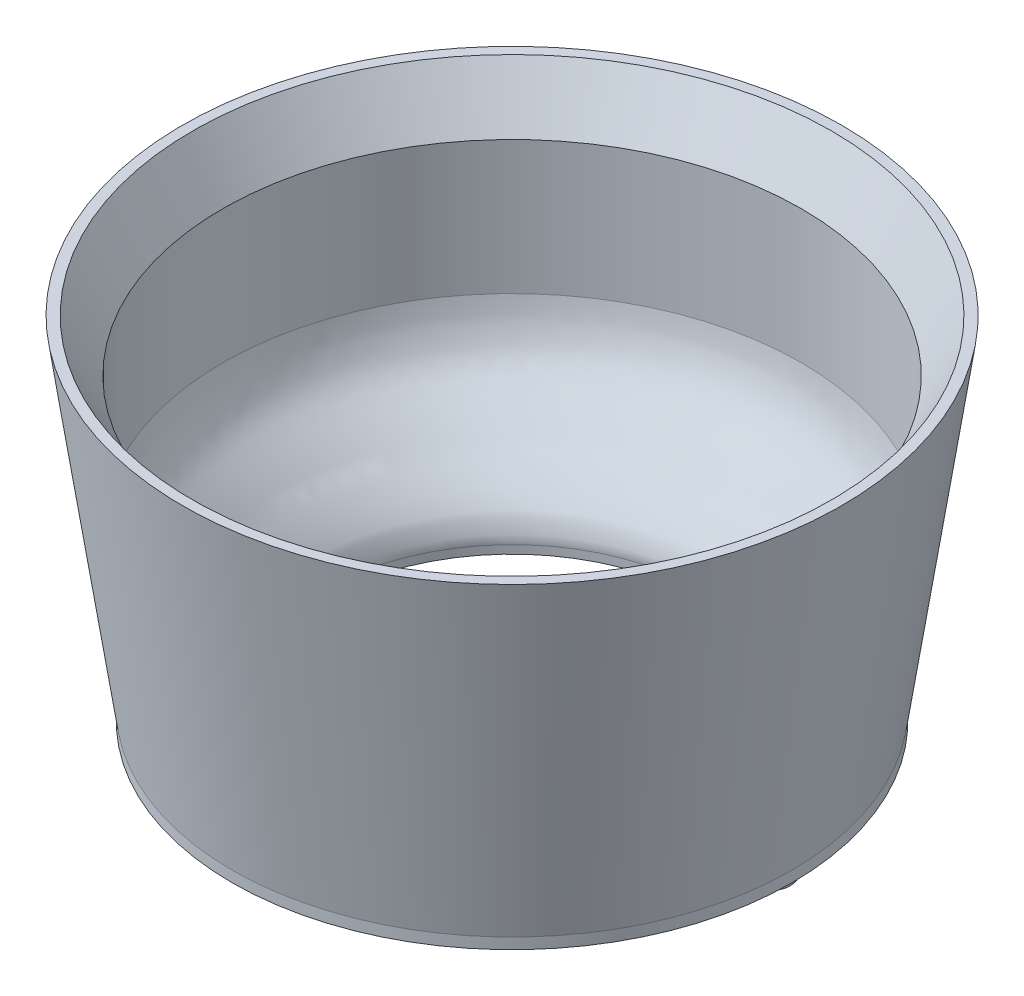
ISO-10303-21;
HEADER;
FILE_DESCRIPTION(('STEP AP214'),'2;1');
FILE_NAME('part.step','',(''),(''),'','','');
FILE_SCHEMA(('AUTOMOTIVE_DESIGN { 1 0 10303 214 1 1 1 1 }'));
ENDSEC;
DATA;
#1=APPLICATION_CONTEXT('core data for automotive mechanical design processes');
#2=APPLICATION_PROTOCOL_DEFINITION('international standard','automotive_design',2000,#1);
#3=PRODUCT_CONTEXT('',#1,'mechanical');
#4=PRODUCT('Part','Part','',(#3));
#5=PRODUCT_RELATED_PRODUCT_CATEGORY('part','',(#4));
#6=PRODUCT_DEFINITION_FORMATION('','',#4);
#7=PRODUCT_DEFINITION_CONTEXT('part definition',#1,'design');
#8=PRODUCT_DEFINITION('design','',#6,#7);
#9=PRODUCT_DEFINITION_SHAPE('','',#8);
#10=(LENGTH_UNIT() NAMED_UNIT(*) SI_UNIT(.MILLI.,.METRE.));
#11=(NAMED_UNIT(*) PLANE_ANGLE_UNIT() SI_UNIT($,.RADIAN.));
#12=(NAMED_UNIT(*) SI_UNIT($,.STERADIAN.) SOLID_ANGLE_UNIT());
#13=UNCERTAINTY_MEASURE_WITH_UNIT(LENGTH_MEASURE(1.E-05),#10,'distance_accuracy_value','');
#14=(GEOMETRIC_REPRESENTATION_CONTEXT(3) GLOBAL_UNCERTAINTY_ASSIGNED_CONTEXT((#13)) GLOBAL_UNIT_ASSIGNED_CONTEXT((#10,
#11,#12)) REPRESENTATION_CONTEXT('',''));
#15=CARTESIAN_POINT('',(0.,0.,0.));
#16=DIRECTION('',(0.,0.,1.));
#17=DIRECTION('',(1.,0.,0.));
#18=AXIS2_PLACEMENT_3D('',#15,#16,#17);
#19=CARTESIAN_POINT('',(0.,295.540718437762,-40.5476747547934));
#20=CARTESIAN_POINT('',(0.,295.012709615636,-40.4477404657415));
#21=CARTESIAN_POINT('',(0.,293.970757618623,-40.2927773525862));
#22=CARTESIAN_POINT('',(0.,292.587532752845,-39.930889754875));
#23=CARTESIAN_POINT('',(0.,291.581451359409,-39.51618641559));
#24=CARTESIAN_POINT('',(0.,290.578047280025,-39.1083707824325));
#25=CARTESIAN_POINT('',(0.,289.316986818185,-38.4396980542591));
#26=CARTESIAN_POINT('',(0.,288.032583078736,-37.3314160861705));
#27=CARTESIAN_POINT('',(0.,287.115418473763,-36.3683638812662));
#28=CARTESIAN_POINT('',(0.,286.340079672536,-35.6302312643945));
#29=CARTESIAN_POINT('',(0.,285.762737125999,-35.0164727262729));
#30=CARTESIAN_POINT('',(0.,285.247169223289,-34.3942597952709));
#31=CARTESIAN_POINT('',(0.,284.556557999368,-33.6355246615368));
#32=CARTESIAN_POINT('',(0.,283.771384037677,-32.9203613336381));
#33=CARTESIAN_POINT('',(0.,282.986073935963,-32.12965190107));
#34=CARTESIAN_POINT('',(0.,282.459482322822,-31.4852417836461));
#35=CARTESIAN_POINT('',(0.,281.963476572773,-30.9149972084707));
#36=CARTESIAN_POINT('',(0.,281.391298158875,-30.3717003462487));
#37=CARTESIAN_POINT('',(0.,280.804626849955,-29.7827961587849));
#38=CARTESIAN_POINT('',(0.,280.262154528045,-29.2275845813112));
#39=CARTESIAN_POINT('',(0.,279.674853681479,-28.7247526180959));
#40=CARTESIAN_POINT('',(0.,279.039651715273,-28.1803862534295));
#41=CARTESIAN_POINT('',(0.,278.470209991792,-27.651838315325));
#42=CARTESIAN_POINT('',(0.,277.876839186641,-27.3081459354535));
#43=CARTESIAN_POINT('',(0.,277.127164256162,-26.9952300805427));
#44=CARTESIAN_POINT('',(0.,276.164510632259,-26.5979526177344));
#45=CARTESIAN_POINT('',(0.,275.470548140668,-26.4648115829165));
#46=CARTESIAN_POINT('',(0.,274.996982716808,-26.5077562004189));
#47=B_SPLINE_CURVE_WITH_KNOTS('',3,(#19,#20,#21,#22,#23,#24,#25,#26,#27,#28,#29,#30,#31,#32,#33,
#34,#35,#36,#37,#38,#39,#40,#41,#42,#43,#44,#45,#46),.UNSPECIFIED.,.F.,.F.,(4,1,1,1,1,1,1,1,1,1,
1,1,1,1,1,1,1,1,1,1,1,1,1,1,1,4),(0.,0.0625440482121128,0.125088096424226,0.156360120530282,
0.187632144636338,0.250176192848451,0.312720241060564,0.375264289272677,0.406536313378733,
0.43780833748479,0.469080361590846,0.500352385696902,0.562896433909015,0.594168458015071,
0.625440482121128,0.656712506227184,0.687984530333241,0.719256554439297,0.750528578545353,
0.78180060265141,0.813072626757466,0.844344650863523,0.875616674969579,0.906888699075636,
0.938160723181692,1.0007047713938),.UNSPECIFIED.);
#48=CARTESIAN_POINT('',(0.,5.,0.));
#49=DIRECTION('',(0.,-1.,0.));
#50=AXIS1_PLACEMENT('',#48,#49);
#51=SURFACE_OF_REVOLUTION('',#47,#50);
#52=CARTESIAN_POINT('',(0.,274.996982716808,8.64791079751593E-13));
#53=DIRECTION('',(0.,-1.,0.));
#54=DIRECTION('',(0.,0.,-1.));
#55=AXIS2_PLACEMENT_3D('',#52,#53,#54);
#56=CIRCLE('',#55,26.5077562004197);
#57=CARTESIAN_POINT('',(0.,274.996982716808,-26.5077562004189));
#58=VERTEX_POINT('',#57);
#59=EDGE_CURVE('E129',#58,#58,#56,.T.);
#60=ORIENTED_EDGE('',*,*,#59,.T.);
#61=EDGE_LOOP('',(#60));
#62=FACE_BOUND('',#61,.T.);
#63=CARTESIAN_POINT('',(0.,295.540718437762,9.30591960996588E-13));
#64=DIRECTION('',(0.,-1.,0.));
#65=DIRECTION('',(0.,0.,-1.));
#66=AXIS2_PLACEMENT_3D('',#63,#64,#65);
#67=CIRCLE('',#66,40.5476747547944);
#68=CARTESIAN_POINT('',(0.,295.540718437762,-40.5476747547934));
#69=VERTEX_POINT('',#68);
#70=EDGE_CURVE('E51',#69,#69,#67,.T.);
#71=ORIENTED_EDGE('',*,*,#70,.F.);
#72=EDGE_LOOP('',(#71));
#73=FACE_BOUND('',#72,.T.);
#74=ADVANCED_FACE('F31',(#62,#73),#51,.F.);
#75=CARTESIAN_POINT('',(0.,5.,0.));
#76=DIRECTION('',(0.,-1.,0.));
#77=DIRECTION('',(0.,0.,-1.));
#78=AXIS2_PLACEMENT_3D('',#75,#76,#77);
#79=CYLINDRICAL_SURFACE('',#78,40.5476747547944);
#80=ORIENTED_EDGE('',*,*,#70,.T.);
#81=EDGE_LOOP('',(#80));
#82=FACE_BOUND('',#81,.T.);
#83=CARTESIAN_POINT('',(0.,314.238618936809,9.90480695303734E-13));
#84=DIRECTION('',(0.,-1.,0.));
#85=DIRECTION('',(0.,0.,-1.));
#86=AXIS2_PLACEMENT_3D('',#83,#84,#85);
#87=CIRCLE('',#86,40.5476747547944);
#88=CARTESIAN_POINT('',(0.,314.238618936809,-40.5476747547934));
#89=VERTEX_POINT('',#88);
#90=EDGE_CURVE('E143',#89,#89,#87,.T.);
#91=ORIENTED_EDGE('',*,*,#90,.F.);
#92=EDGE_LOOP('',(#91));
#93=FACE_BOUND('',#92,.T.);
#94=ADVANCED_FACE('F115',(#82,#93),#79,.F.);
#95=CARTESIAN_POINT('',(0.,321.561079724369,1.01393428618166E-12));
#96=DIRECTION('',(0.,1.,0.));
#97=DIRECTION('',(0.,0.,1.));
#98=AXIS2_PLACEMENT_3D('',#95,#96,#97);
#99=CONICAL_SURFACE('',#98,44.775299461623,0.523598775598309);
#100=ORIENTED_EDGE('',*,*,#90,.T.);
#101=EDGE_LOOP('',(#100));
#102=FACE_BOUND('',#101,.T.);
#103=CARTESIAN_POINT('',(0.,321.561079724369,1.01393428618166E-12));
#104=DIRECTION('',(0.,-1.,0.));
#105=DIRECTION('',(0.,0.,-1.));
#106=AXIS2_PLACEMENT_3D('',#103,#104,#105);
#107=CIRCLE('',#106,44.775299461623);
#108=CARTESIAN_POINT('',(0.,321.561079724369,-44.775299461622));
#109=VERTEX_POINT('',#108);
#110=EDGE_CURVE('E141',#109,#109,#107,.T.);
#111=ORIENTED_EDGE('',*,*,#110,.F.);
#112=EDGE_LOOP('',(#111));
#113=FACE_BOUND('',#112,.T.);
#114=ADVANCED_FACE('F111',(#102,#113),#99,.F.);
#115=CARTESIAN_POINT('',(0.,321.561079724369,-44.775299461622));
#116=DIRECTION('',(0.,1.,0.));
#117=DIRECTION('',(0.,0.,1.));
#118=AXIS2_PLACEMENT_3D('',#115,#116,#117);
#119=PLANE('',#118);
#120=ORIENTED_EDGE('',*,*,#110,.T.);
#121=EDGE_LOOP('',(#120));
#122=FACE_BOUND('',#121,.T.);
#123=CARTESIAN_POINT('',(0.,321.561079724369,1.01393428618166E-12));
#124=DIRECTION('',(0.,-1.,0.));
#125=DIRECTION('',(0.,0.,-1.));
#126=AXIS2_PLACEMENT_3D('',#123,#124,#125);
#127=CIRCLE('',#126,46.181267187361);
#128=CARTESIAN_POINT('',(0.,321.561079724369,-46.1812671873599));
#129=VERTEX_POINT('',#128);
#130=EDGE_CURVE('E138',#129,#129,#127,.T.);
#131=ORIENTED_EDGE('',*,*,#130,.F.);
#132=EDGE_LOOP('',(#131));
#133=FACE_BOUND('',#132,.T.);
#134=ADVANCED_FACE('F107',(#122,#133),#119,.T.);
#135=CARTESIAN_POINT('',(0.,273.84861893681,8.61112909931847E-13));
#136=DIRECTION('',(0.,1.,0.));
#137=DIRECTION('',(0.,0.,1.));
#138=AXIS2_PLACEMENT_3D('',#135,#136,#137);
#139=CONICAL_SURFACE('',#138,39.2207719119618,0.144862327915536);
#140=ORIENTED_EDGE('',*,*,#130,.T.);
#141=EDGE_LOOP('',(#140));
#142=FACE_BOUND('',#141,.T.);
#143=CARTESIAN_POINT('',(0.,273.84861893681,8.61112909931847E-13));
#144=DIRECTION('',(0.,-1.,0.));
#145=DIRECTION('',(0.,0.,-1.));
#146=AXIS2_PLACEMENT_3D('',#143,#144,#145);
#147=CIRCLE('',#146,39.2207719119618);
#148=CARTESIAN_POINT('',(0.,273.84861893681,-39.2207719119609));
#149=VERTEX_POINT('',#148);
#150=EDGE_CURVE('E135',#149,#149,#147,.T.);
#151=ORIENTED_EDGE('',*,*,#150,.F.);
#152=EDGE_LOOP('',(#151));
#153=FACE_BOUND('',#152,.T.);
#154=ADVANCED_FACE('F103',(#142,#153),#139,.T.);
#155=CARTESIAN_POINT('',(0.,5.,0.));
#156=DIRECTION('',(0.,-1.,0.));
#157=DIRECTION('',(0.,0.,-1.));
#158=AXIS2_PLACEMENT_3D('',#155,#156,#157);
#159=CYLINDRICAL_SURFACE('',#158,26.5077562004197);
#160=ORIENTED_EDGE('',*,*,#59,.F.);
#161=EDGE_LOOP('',(#160));
#162=FACE_BOUND('',#161,.T.);
#163=CARTESIAN_POINT('',(0.,273.84861893681,8.61112909931847E-13));
#164=DIRECTION('',(0.,-1.,0.));
#165=DIRECTION('',(0.,0.,-1.));
#166=AXIS2_PLACEMENT_3D('',#163,#164,#165);
#167=CIRCLE('',#166,26.5077562004196);
#168=CARTESIAN_POINT('',(0.,273.84861893681,-26.5077562004188));
#169=VERTEX_POINT('',#168);
#170=EDGE_CURVE('E161',#169,#169,#167,.T.);
#171=ORIENTED_EDGE('',*,*,#170,.T.);
#172=EDGE_LOOP('',(#171));
#173=FACE_BOUND('',#172,.T.);
#174=ADVANCED_FACE('F79',(#162,#173),#159,.F.);
#175=CARTESIAN_POINT('',(0.,-0.122002410112787,0.));
#176=DIRECTION('',(0.,-1.,0.));
#177=DIRECTION('',(0.,0.,-1.));
#178=AXIS2_PLACEMENT_3D('',#175,#176,#177);
#179=SPHERICAL_SURFACE('',#178,275.25);
#180=CARTESIAN_POINT('',(0.,272.319355593091,8.56214731867291E-13));
#181=DIRECTION('',(0.,-1.,0.));
#182=DIRECTION('',(0.,0.,-1.));
#183=AXIS2_PLACEMENT_3D('',#180,#181,#182);
#184=CIRCLE('',#183,39.2207719119618);
#185=CARTESIAN_POINT('',(0.,272.319355593091,-39.2207719119609));
#186=VERTEX_POINT('',#185);
#187=EDGE_CURVE('E68',#186,#186,#184,.T.);
#188=ORIENTED_EDGE('',*,*,#187,.T.);
#189=EDGE_LOOP('',(#188));
#190=FACE_BOUND('',#189,.T.);
#191=ORIENTED_EDGE('',*,*,#170,.F.);
#192=EDGE_LOOP('',(#191));
#193=FACE_BOUND('',#192,.T.);
#194=CARTESIAN_POINT('',(33.8749546324797,273.027343915968,-2.11758970404298));
#195=CARTESIAN_POINT('',(33.9946255918528,273.011571570247,-2.23767123551081));
#196=CARTESIAN_POINT('',(34.1245040968203,272.994453356898,-2.3475887353589));
#197=CARTESIAN_POINT('',(34.4008520390891,272.958025441235,-2.54391922780289));
#198=CARTESIAN_POINT('',(34.5473429744087,272.938712899193,-2.6303012602179));
#199=CARTESIAN_POINT('',(34.8524966071203,272.898478715978,-2.77702394144181));
#200=CARTESIAN_POINT('',(35.0111496063841,272.877558356857,-2.83738509025877));
#201=CARTESIAN_POINT('',(35.3361722412429,272.834694827109,-2.93051356725582));
#202=CARTESIAN_POINT('',(35.5025399050803,272.812751917823,-2.96328790566186));
#203=CARTESIAN_POINT('',(35.839196082136,272.768343470642,-3.00049354247543));
#204=CARTESIAN_POINT('',(36.0094999093397,272.745875885781,-3.00478396400958));
#205=CARTESIAN_POINT('',(36.3484233203112,272.70115738697,-2.98453076823693));
#206=CARTESIAN_POINT('',(36.5170427982252,272.67890648664,-2.95998535008121));
#207=CARTESIAN_POINT('',(36.8481518335042,272.635208395365,-2.88263766802271));
#208=CARTESIAN_POINT('',(37.0106282485456,272.613762928131,-2.82977812849712));
#209=CARTESIAN_POINT('',(37.3244311609616,272.572339089419,-2.69720093371106));
#210=CARTESIAN_POINT('',(37.4757578057846,272.552360698539,-2.61748363370416));
#211=CARTESIAN_POINT('',(37.7623667279895,272.514518351287,-2.43370928123283));
#212=CARTESIAN_POINT('',(37.8977035791574,272.496647203254,-2.32973884689504));
#213=CARTESIAN_POINT('',(38.1489845520952,272.46346288134,-2.10019514455802));
#214=CARTESIAN_POINT('',(38.2649294547086,272.448149604462,-1.9746227468048));
#215=CARTESIAN_POINT('',(38.4731849063026,272.42064264764,-1.70644692772509));
#216=CARTESIAN_POINT('',(38.5656677224036,272.408426229969,-1.56397962653297));
#217=CARTESIAN_POINT('',(38.725377430689,272.387328506853,-1.26530317804507));
#218=CARTESIAN_POINT('',(38.792605507785,272.378447044938,-1.10909467588874));
#219=CARTESIAN_POINT('',(38.8993323929752,272.364347004578,-0.788758022024961));
#220=CARTESIAN_POINT('',(38.9390555814838,272.359098786785,-0.624705914163987));
#221=CARTESIAN_POINT('',(38.9904718889534,272.35230561865,-0.29219319561628));
#222=CARTESIAN_POINT('',(39.0021660234469,272.350760534138,-0.123732744873655));
#223=CARTESIAN_POINT('',(38.997186659629,272.351418423116,0.211869858490369));
#224=CARTESIAN_POINT('',(38.9806621553328,272.353601710853,0.379014282792876));
#225=CARTESIAN_POINT('',(38.9200259402605,272.361612965465,0.708128761398616));
#226=CARTESIAN_POINT('',(38.8759144524269,272.367440902886,0.870098857506726));
#227=CARTESIAN_POINT('',(38.7614128306319,272.38256788735,1.18429669928788));
#228=CARTESIAN_POINT('',(38.6910217854247,272.391867054758,1.33652410691797));
#229=CARTESIAN_POINT('',(38.5260296593685,272.413662196915,1.62698297464568));
#230=CARTESIAN_POINT('',(38.4314280560132,272.426158240656,1.76521413258992));
#231=CARTESIAN_POINT('',(38.2201959771322,272.454057772523,2.02456087718759));
#232=CARTESIAN_POINT('',(38.1034519102156,272.469476252536,2.14558231389962));
#233=CARTESIAN_POINT('',(37.8516224269834,272.50273227336,2.3663337965269));
#234=CARTESIAN_POINT('',(37.7165362475426,272.52056991482,2.46606295613066));
#235=CARTESIAN_POINT('',(37.4306737427883,272.558312884213,2.64227054268679));
#236=CARTESIAN_POINT('',(37.2797778288821,272.57823396943,2.71855158458783));
#237=CARTESIAN_POINT('',(36.967497890215,272.61945589135,2.84469853046805));
#238=CARTESIAN_POINT('',(36.8061134047961,272.640756788655,2.8945632733625));
#239=CARTESIAN_POINT('',(36.4761246940793,272.684306166946,2.96682453643983));
#240=CARTESIAN_POINT('',(36.307475029939,272.706560604882,2.98901006648788));
#241=CARTESIAN_POINT('',(35.9688695627536,272.751236274951,3.00462269388512));
#242=CARTESIAN_POINT('',(35.798913722962,272.773657511775,2.99804897917407));
#243=CARTESIAN_POINT('',(35.4618658165989,272.818116768555,2.95623968415439));
#244=CARTESIAN_POINT('',(35.2947865206912,272.840153083914,2.92089920176638));
#245=CARTESIAN_POINT('',(34.9688973958066,272.88313005006,2.82237568789331));
#246=CARTESIAN_POINT('',(34.8100875459998,272.904070703606,2.75919272654443));
#247=CARTESIAN_POINT('',(34.5055927083349,272.944217081892,2.60685121726622));
#248=CARTESIAN_POINT('',(34.3598836369428,272.96342599033,2.51774166417435));
#249=CARTESIAN_POINT('',(34.0854934513466,272.99959559915,2.31595836331211));
#250=CARTESIAN_POINT('',(33.9568118367102,273.016556365603,2.20328530831777));
#251=CARTESIAN_POINT('',(33.7210614432233,273.047626788406,1.95835161463734));
#252=CARTESIAN_POINT('',(33.6138552678917,273.061754570388,1.82622554007228));
#253=CARTESIAN_POINT('',(33.423178976413,273.086880630153,1.54556492022524));
#254=CARTESIAN_POINT('',(33.3397077882082,273.097879049283,1.39703111646558));
#255=CARTESIAN_POINT('',(33.1996066210056,273.116338435794,1.0891134663106));
#256=CARTESIAN_POINT('',(33.1427569053951,273.123828362834,0.929831324859043));
#257=CARTESIAN_POINT('',(33.056574865539,273.135182568052,0.603872719925396));
#258=CARTESIAN_POINT('',(33.0272402992623,273.139047141638,0.437196860068817));
#259=CARTESIAN_POINT('',(32.9970685303585,273.143022007651,0.102355018709671));
#260=CARTESIAN_POINT('',(32.9960445789547,273.143156902615,-0.0657938749417435));
#261=CARTESIAN_POINT('',(33.022056314508,273.139730087022,-0.399913198409728));
#262=CARTESIAN_POINT('',(33.0490985786319,273.136167509983,-0.565883108361235));
#263=CARTESIAN_POINT('',(33.1303797820679,273.125459036982,-0.890663442453825));
#264=CARTESIAN_POINT('',(33.1845850724319,273.118317574464,-1.04948246032236));
#265=CARTESIAN_POINT('',(33.3185413833028,273.100667926415,-1.35559162359865));
#266=CARTESIAN_POINT('',(33.3982616194472,273.090163798015,-1.50289539728304));
#267=CARTESIAN_POINT('',(33.5454921535454,273.070763135133,-1.72796945223022));
#268=CARTESIAN_POINT('',(33.6058183344297,273.062813667146,-1.81061481959806));
#269=CARTESIAN_POINT('',(33.7345138007604,273.045853486122,-1.96926552105312));
#270=CARTESIAN_POINT('',(33.8028830662077,273.036842775724,-2.04527087164987));
#271=CARTESIAN_POINT('',(33.8749546324797,273.027343915968,-2.11758970404298));
#272=B_SPLINE_CURVE_WITH_KNOTS('',3,(#194,#195,#196,#197,#198,#199,#200,#201,#202,#203,#204,
#205,#206,#207,#208,#209,#210,#211,#212,#213,#214,#215,#216,#217,#218,#219,#220,#221,#222,#223,
#224,#225,#226,#227,#228,#229,#230,#231,#232,#233,#234,#235,#236,#237,#238,#239,#240,#241,#242,
#243,#244,#245,#246,#247,#248,#249,#250,#251,#252,#253,#254,#255,#256,#257,#258,#259,#260,#261,
#262,#263,#264,#265,#266,#267,#268,#269,#270,#271),.UNSPECIFIED.,.T.,.F.,(4,2,2,2,2,2,2,2,2,2,2,
2,2,2,2,2,2,2,2,2,2,2,2,2,2,2,2,2,2,2,2,2,2,2,2,2,2,2,4),(0.,0.510411092370759,1.02149040809802,
1.53216634155756,2.04271246532371,2.5557817990423,3.06888317654705,3.5830264300257,
4.09716288308411,4.60949051592829,5.12179751422618,5.6302263655349,6.13863135920392,
6.64283838944448,7.14702715127048,7.64856202702369,8.15009284970795,8.65164106463003,
9.1532001047521,9.65740538010273,10.1616316393923,10.669993025179,11.1783767532964,
11.6906125162721,12.2028627430832,12.7169893759339,13.2311147136892,13.7442747231982,
14.2574196477259,14.7671686120987,15.2768945485609,15.7823355774705,16.2877354176861,
16.7898006259682,17.2919835171062,17.7935458475026,18.2945052984356,18.6018999957717,
18.9092939287899),.UNSPECIFIED.);
#273=CARTESIAN_POINT('',(33.8749546324797,273.027343915968,-2.11758970404298));
#274=VERTEX_POINT('',#273);
#275=EDGE_CURVE('E59',#274,#274,#272,.T.);
#276=ORIENTED_EDGE('',*,*,#275,.F.);
#277=EDGE_LOOP('',(#276));
#278=FACE_BOUND('',#277,.T.);
#279=CARTESIAN_POINT('',(-33.2590103588884,272.651694686228,15.8401673709966));
#280=CARTESIAN_POINT('',(-33.1366486523362,272.67346331601,15.7222201356085));
#281=CARTESIAN_POINT('',(-33.0041923593675,272.695698577436,15.6146460661028));
#282=CARTESIAN_POINT('',(-32.7229016548393,272.740458799461,15.4233902340738));
#283=CARTESIAN_POINT('',(-32.5740469324512,272.7629840881,15.3397385729914));
#284=CARTESIAN_POINT('',(-32.2643340630194,272.807658096591,15.1988511914902));
#285=CARTESIAN_POINT('',(-32.103481467295,272.829806984846,15.1416033412438));
#286=CARTESIAN_POINT('',(-31.7743239375758,272.873100586927,15.0551651332863));
#287=CARTESIAN_POINT('',(-31.6060209932402,272.894245565764,15.0259673313698));
#288=CARTESIAN_POINT('',(-31.2668970854563,272.934909427738,14.9965292896966));
#289=CARTESIAN_POINT('',(-31.0960791872777,272.954430124088,14.9962563153222));
#290=CARTESIAN_POINT('',(-30.7566278748874,272.991307156339,15.0247072463608));
#291=CARTESIAN_POINT('',(-30.5879944920737,273.008663461162,15.0534315680841));
#292=CARTESIAN_POINT('',(-30.258859680762,273.040598684209,15.1388986912946));
#293=CARTESIAN_POINT('',(-30.0983134330176,273.055194530902,15.1954625069505));
#294=CARTESIAN_POINT('',(-29.7888766248049,273.08131320188,15.3350135675391));
#295=CARTESIAN_POINT('',(-29.6399854890361,273.09283617791,15.4179995072401));
#296=CARTESIAN_POINT('',(-29.3594174423863,273.112381147074,15.6072816783837));
#297=CARTESIAN_POINT('',(-29.2276061970739,273.120431789518,15.7133758436361));
#298=CARTESIAN_POINT('',(-28.9835806397011,273.132931538664,15.9462883044705));
#299=CARTESIAN_POINT('',(-28.871365456445,273.137380805508,16.0731056782607));
#300=CARTESIAN_POINT('',(-28.6704875209152,273.142526546222,16.3429178513289));
#301=CARTESIAN_POINT('',(-28.5816704642277,273.143248222176,16.4857973189748));
#302=CARTESIAN_POINT('',(-28.4291351870777,273.140985384571,16.7843490730782));
#303=CARTESIAN_POINT('',(-28.3654164944494,273.138000940737,16.9400211188073));
#304=CARTESIAN_POINT('',(-28.2649708091762,273.12842533878,17.2593638631004));
#305=CARTESIAN_POINT('',(-28.2281860336537,273.121841955021,17.4230166302817));
#306=CARTESIAN_POINT('',(-28.1823543442891,273.105267922482,17.7539891453095));
#307=CARTESIAN_POINT('',(-28.1733077078797,273.095277239625,17.921308929816));
#308=CARTESIAN_POINT('',(-28.1831261664541,273.072140728118,18.2554710279103));
#309=CARTESIAN_POINT('',(-28.2020853404779,273.058984389609,18.4223098371341));
#310=CARTESIAN_POINT('',(-28.2674384393132,273.029914747768,18.750273303905));
#311=CARTESIAN_POINT('',(-28.3138333361058,273.014001346774,18.911397758792));
#312=CARTESIAN_POINT('',(-28.4330930713117,272.979743541132,19.2246368885784));
#313=CARTESIAN_POINT('',(-28.50615116394,272.961382025522,19.3766761045067));
#314=CARTESIAN_POINT('',(-28.6765353477189,272.922841463081,19.6662311592779));
#315=CARTESIAN_POINT('',(-28.7738625354782,272.902662334146,19.8037463414467));
#316=CARTESIAN_POINT('',(-28.9908975198557,272.86087981763,20.0615411562449));
#317=CARTESIAN_POINT('',(-29.1107831024872,272.839266065422,20.1816694515712));
#318=CARTESIAN_POINT('',(-29.3689859988126,272.795374076721,20.3999961123806));
#319=CARTESIAN_POINT('',(-29.507303982277,272.773095816103,20.4981936806289));
#320=CARTESIAN_POINT('',(-29.7992892307647,272.728375703867,20.6703994037194));
#321=CARTESIAN_POINT('',(-29.9530370919048,272.705933628549,20.7442708896778));
#322=CARTESIAN_POINT('',(-30.2708902356241,272.66164512563,20.8649642236761));
#323=CARTESIAN_POINT('',(-30.4349956323834,272.639798704601,20.9117857734634));
#324=CARTESIAN_POINT('',(-30.7689824475017,272.597316565374,20.9770038049085));
#325=CARTESIAN_POINT('',(-30.938866026319,272.576681308068,20.9953895323297));
#326=CARTESIAN_POINT('',(-31.2795038086945,272.53722654336,21.0030811723651));
#327=CARTESIAN_POINT('',(-31.4502579948654,272.518406999844,20.9923876634768));
#328=CARTESIAN_POINT('',(-31.7868716256231,272.483223297653,20.942237923923));
#329=CARTESIAN_POINT('',(-31.9527512377912,272.466847359041,20.9029254368069));
#330=CARTESIAN_POINT('',(-32.2756987913944,272.436923163682,20.796705802933));
#331=CARTESIAN_POINT('',(-32.4327671245241,272.423374781167,20.7297998839132));
#332=CARTESIAN_POINT('',(-32.7322599692915,272.39961022253,20.5708762614444));
#333=CARTESIAN_POINT('',(-32.8747936998702,272.389367710379,20.4790683240031));
#334=CARTESIAN_POINT('',(-33.1425120752307,272.372372243099,20.2726617240622));
#335=CARTESIAN_POINT('',(-33.2676974990849,272.365619131232,20.1580640855586));
#336=CARTESIAN_POINT('',(-33.496163371191,272.355845357645,19.9103042874843));
#337=CARTESIAN_POINT('',(-33.5996054684722,272.352796283253,19.7772922793833));
#338=CARTESIAN_POINT('',(-33.7828112584668,272.35042759076,19.4958264476924));
#339=CARTESIAN_POINT('',(-33.8625755738438,272.351107874577,19.3473730303096));
#340=CARTESIAN_POINT('',(-33.9958955794366,272.356167402743,19.0398672089342));
#341=CARTESIAN_POINT('',(-34.0495500452192,272.360532532809,18.8808573780482));
#342=CARTESIAN_POINT('',(-34.1296272911819,272.372812384794,18.556263912617));
#343=CARTESIAN_POINT('',(-34.1560511302938,272.380726968666,18.3906805339611));
#344=CARTESIAN_POINT('',(-34.1810268251986,272.399886666893,18.0573516997349));
#345=CARTESIAN_POINT('',(-34.1795337647503,272.411137119794,17.8896031939531));
#346=CARTESIAN_POINT('',(-34.1487083219511,272.436638123553,17.5568725190563));
#347=CARTESIAN_POINT('',(-34.1193682254805,272.450889504868,17.3918911293696));
#348=CARTESIAN_POINT('',(-34.0334886837072,272.482085456156,17.0682135313135));
#349=CARTESIAN_POINT('',(-33.9767617403481,272.499048044216,16.9095689354786));
#350=CARTESIAN_POINT('',(-33.8377659883106,272.535095767158,16.6043155632237));
#351=CARTESIAN_POINT('',(-33.7555266008731,272.554178440944,16.4576931676599));
#352=CARTESIAN_POINT('',(-33.6031946058346,272.586460136023,16.2324793852584));
#353=CARTESIAN_POINT('',(-33.54010744078,272.599182779563,16.1489913955352));
#354=CARTESIAN_POINT('',(-33.4056216518477,272.625109741319,15.9890849639768));
#355=CARTESIAN_POINT('',(-33.334222998575,272.638314061239,15.9126665471461));
#356=CARTESIAN_POINT('',(-33.2590103588884,272.651694686228,15.8401673709966));
#357=B_SPLINE_CURVE_WITH_KNOTS('',3,(#279,#280,#281,#282,#283,#284,#285,#286,#287,#288,#289,
#290,#291,#292,#293,#294,#295,#296,#297,#298,#299,#300,#301,#302,#303,#304,#305,#306,#307,#308,
#309,#310,#311,#312,#313,#314,#315,#316,#317,#318,#319,#320,#321,#322,#323,#324,#325,#326,#327,
#328,#329,#330,#331,#332,#333,#334,#335,#336,#337,#338,#339,#340,#341,#342,#343,#344,#345,#346,
#347,#348,#349,#350,#351,#352,#353,#354,#355,#356),.UNSPECIFIED.,.T.,.F.,(4,2,2,2,2,2,2,2,2,2,2,
2,2,2,2,2,2,2,2,2,2,2,2,2,2,2,2,2,2,2,2,2,2,2,2,2,2,2,4),(0.,0.513638961778382,1.02792141725839,
1.54196737709242,2.05587687649453,2.56920477136186,3.08254003611507,3.5926172451776,
4.10266926074227,4.60842849359118,5.11416523582066,5.61647819531593,6.11878170453939,
6.62000441026349,7.12123212912766,7.62414744017898,8.12708056936988,8.63373378923373,
9.14040990657586,9.65126050053787,10.1621296621286,10.6758218777721,11.1895197572777,
11.7034118663974,12.2172937523073,12.7286122345067,13.2399079686336,13.7470237468639,
14.2541167443108,14.7572948957537,15.2604598137583,15.7617061291419,16.2629329515558,
16.7649662804107,17.2671387219473,17.7727990086306,18.2778783163298,18.5935980510105,
18.9093189023275),.UNSPECIFIED.);
#358=CARTESIAN_POINT('',(-33.2590103588884,272.651694686228,15.8401673709966));
#359=VERTEX_POINT('',#358);
#360=EDGE_CURVE('E67',#359,#359,#357,.T.);
#361=ORIENTED_EDGE('',*,*,#360,.F.);
#362=EDGE_LOOP('',(#361));
#363=FACE_BOUND('',#362,.T.);
#364=ADVANCED_FACE('F74',(#190,#193,#278,#363),#179,.F.);
#365=CARTESIAN_POINT('',(0.,5.,0.));
#366=DIRECTION('',(0.,-1.,0.));
#367=DIRECTION('',(0.,0.,-1.));
#368=AXIS2_PLACEMENT_3D('',#365,#366,#367);
#369=CYLINDRICAL_SURFACE('',#368,39.2207719119618);
#370=ORIENTED_EDGE('',*,*,#150,.T.);
#371=EDGE_LOOP('',(#370));
#372=FACE_BOUND('',#371,.T.);
#373=ORIENTED_EDGE('',*,*,#187,.F.);
#374=EDGE_LOOP('',(#373));
#375=FACE_BOUND('',#374,.T.);
#376=ADVANCED_FACE('F78',(#372,#375),#369,.T.);
#377=CARTESIAN_POINT('',(-31.1769145362399,271.84861893681,18.0000000000007));
#378=DIRECTION('',(0.,-1.,0.));
#379=DIRECTION('',(0.,0.,-1.));
#380=AXIS2_PLACEMENT_3D('',#377,#378,#379);
#381=PLANE('',#380);
#382=CARTESIAN_POINT('',(-31.1769145362399,271.84861893681,18.0000000000007));
#383=DIRECTION('',(0.,-1.,0.));
#384=DIRECTION('',(0.,0.,-1.));
#385=AXIS2_PLACEMENT_3D('',#382,#383,#384);
#386=CIRCLE('',#385,2.55);
#387=CARTESIAN_POINT('',(-31.1769145362399,271.84861893681,15.4500000000007));
#388=VERTEX_POINT('',#387);
#389=EDGE_CURVE('E46',#388,#388,#386,.F.);
#390=ORIENTED_EDGE('',*,*,#389,.T.);
#391=EDGE_LOOP('',(#390));
#392=FACE_BOUND('',#391,.T.);
#393=CARTESIAN_POINT('',(-31.1769145362399,271.84861893681,18.0000000000007));
#394=DIRECTION('',(0.,-1.,0.));
#395=DIRECTION('',(0.,0.,-1.));
#396=AXIS2_PLACEMENT_3D('',#393,#394,#395);
#397=CIRCLE('',#396,3.);
#398=CARTESIAN_POINT('',(-31.1769145362399,271.84861893681,15.0000000000007));
#399=VERTEX_POINT('',#398);
#400=EDGE_CURVE('E128',#399,#399,#397,.T.);
#401=ORIENTED_EDGE('',*,*,#400,.T.);
#402=EDGE_LOOP('',(#401));
#403=FACE_BOUND('',#402,.T.);
#404=ADVANCED_FACE('F99',(#392,#403),#381,.T.);
#405=CARTESIAN_POINT('',(-31.1769145362399,271.84861893681,18.0000000000007));
#406=DIRECTION('',(0.,1.,0.));
#407=DIRECTION('',(0.,0.,1.));
#408=AXIS2_PLACEMENT_3D('',#405,#406,#407);
#409=CYLINDRICAL_SURFACE('',#408,3.);
#410=ORIENTED_EDGE('',*,*,#360,.T.);
#411=EDGE_LOOP('',(#410));
#412=FACE_BOUND('',#411,.T.);
#413=ORIENTED_EDGE('',*,*,#400,.F.);
#414=EDGE_LOOP('',(#413));
#415=FACE_BOUND('',#414,.T.);
#416=ADVANCED_FACE('F95',(#412,#415),#409,.T.);
#417=CARTESIAN_POINT('',(36.,271.84861893681,8.70721807087471E-13));
#418=DIRECTION('',(0.,-1.,0.));
#419=DIRECTION('',(0.,0.,-1.));
#420=AXIS2_PLACEMENT_3D('',#417,#418,#419);
#421=PLANE('',#420);
#422=CARTESIAN_POINT('',(36.,271.84861893681,8.70721807087471E-13));
#423=DIRECTION('',(0.,-1.,0.));
#424=DIRECTION('',(0.,0.,-1.));
#425=AXIS2_PLACEMENT_3D('',#422,#423,#424);
#426=CIRCLE('',#425,2.55000000000001);
#427=CARTESIAN_POINT('',(36.,271.84861893681,-2.54999999999914));
#428=VERTEX_POINT('',#427);
#429=EDGE_CURVE('E42',#428,#428,#426,.F.);
#430=ORIENTED_EDGE('',*,*,#429,.T.);
#431=EDGE_LOOP('',(#430));
#432=FACE_BOUND('',#431,.T.);
#433=CARTESIAN_POINT('',(36.,271.84861893681,8.70721807087471E-13));
#434=DIRECTION('',(0.,-1.,0.));
#435=DIRECTION('',(0.,0.,-1.));
#436=AXIS2_PLACEMENT_3D('',#433,#434,#435);
#437=CIRCLE('',#436,3.);
#438=CARTESIAN_POINT('',(36.,271.84861893681,-2.99999999999913));
#439=VERTEX_POINT('',#438);
#440=EDGE_CURVE('E92',#439,#439,#437,.T.);
#441=ORIENTED_EDGE('',*,*,#440,.T.);
#442=EDGE_LOOP('',(#441));
#443=FACE_BOUND('',#442,.T.);
#444=ADVANCED_FACE('F82',(#432,#443),#421,.T.);
#445=CARTESIAN_POINT('',(36.,271.84861893681,8.70721807087471E-13));
#446=DIRECTION('',(0.,1.,0.));
#447=DIRECTION('',(0.,0.,1.));
#448=AXIS2_PLACEMENT_3D('',#445,#446,#447);
#449=CYLINDRICAL_SURFACE('',#448,3.);
#450=ORIENTED_EDGE('',*,*,#275,.T.);
#451=EDGE_LOOP('',(#450));
#452=FACE_BOUND('',#451,.T.);
#453=ORIENTED_EDGE('',*,*,#440,.F.);
#454=EDGE_LOOP('',(#453));
#455=FACE_BOUND('',#454,.T.);
#456=ADVANCED_FACE('F70',(#452,#455),#449,.T.);
#457=CARTESIAN_POINT('',(-31.1769145362399,272.34861893681,18.0000000000007));
#458=DIRECTION('',(0.,-1.,0.));
#459=DIRECTION('',(0.,0.,-1.));
#460=AXIS2_PLACEMENT_3D('',#457,#458,#459);
#461=PLANE('',#460);
#462=CARTESIAN_POINT('',(-31.1769145362399,272.34861893681,18.0000000000007));
#463=DIRECTION('',(0.,-1.,0.));
#464=DIRECTION('',(0.,0.,-1.));
#465=AXIS2_PLACEMENT_3D('',#462,#463,#464);
#466=CIRCLE('',#465,2.05);
#467=CARTESIAN_POINT('',(-31.1769145362399,272.34861893681,15.9500000000007));
#468=VERTEX_POINT('',#467);
#469=EDGE_CURVE('E38',#468,#468,#466,.T.);
#470=ORIENTED_EDGE('',*,*,#469,.T.);
#471=EDGE_LOOP('',(#470));
#472=FACE_BOUND('',#471,.T.);
#473=CARTESIAN_POINT('',(-31.1769145362399,272.34861893681,18.0000000000007));
#474=DIRECTION('',(0.,-1.,0.));
#475=DIRECTION('',(0.,0.,-1.));
#476=AXIS2_PLACEMENT_3D('',#473,#474,#475);
#477=CIRCLE('',#476,1.5);
#478=CARTESIAN_POINT('',(-31.1769145362399,272.34861893681,16.5000000000007));
#479=VERTEX_POINT('',#478);
#480=EDGE_CURVE('E56',#479,#479,#477,.F.);
#481=ORIENTED_EDGE('',*,*,#480,.T.);
#482=EDGE_LOOP('',(#481));
#483=FACE_BOUND('',#482,.T.);
#484=ADVANCED_FACE('F180',(#472,#483),#461,.T.);
#485=CARTESIAN_POINT('',(36.,272.34861893681,8.72323289946742E-13));
#486=DIRECTION('',(0.,-1.,0.));
#487=DIRECTION('',(0.,0.,-1.));
#488=AXIS2_PLACEMENT_3D('',#485,#486,#487);
#489=PLANE('',#488);
#490=CARTESIAN_POINT('',(36.,272.34861893681,8.72323289946742E-13));
#491=DIRECTION('',(0.,-1.,0.));
#492=DIRECTION('',(0.,0.,-1.));
#493=AXIS2_PLACEMENT_3D('',#490,#491,#492);
#494=CIRCLE('',#493,2.05);
#495=CARTESIAN_POINT('',(36.,272.34861893681,-2.04999999999913));
#496=VERTEX_POINT('',#495);
#497=EDGE_CURVE('E10',#496,#496,#494,.T.);
#498=ORIENTED_EDGE('',*,*,#497,.T.);
#499=EDGE_LOOP('',(#498));
#500=FACE_BOUND('',#499,.T.);
#501=CARTESIAN_POINT('',(36.,272.34861893681,8.72323289946742E-13));
#502=DIRECTION('',(0.,-1.,0.));
#503=DIRECTION('',(0.,0.,-1.));
#504=AXIS2_PLACEMENT_3D('',#501,#502,#503);
#505=CIRCLE('',#504,1.5);
#506=CARTESIAN_POINT('',(36.,272.34861893681,-1.49999999999913));
#507=VERTEX_POINT('',#506);
#508=EDGE_CURVE('E52',#507,#507,#505,.F.);
#509=ORIENTED_EDGE('',*,*,#508,.T.);
#510=EDGE_LOOP('',(#509));
#511=FACE_BOUND('',#510,.T.);
#512=ADVANCED_FACE('F182',(#500,#511),#489,.T.);
#513=CARTESIAN_POINT('',(-31.1769145362399,277.84861893681,18.0000000000007));
#514=DIRECTION('',(0.,-1.,0.));
#515=DIRECTION('',(0.,0.,-1.));
#516=AXIS2_PLACEMENT_3D('',#513,#514,#515);
#517=PLANE('',#516);
#518=CARTESIAN_POINT('',(-31.1769145362399,277.84861893681,18.0000000000007));
#519=DIRECTION('',(0.,-1.,0.));
#520=DIRECTION('',(0.,0.,-1.));
#521=AXIS2_PLACEMENT_3D('',#518,#519,#520);
#522=CIRCLE('',#521,1.5);
#523=CARTESIAN_POINT('',(-31.1769145362399,277.84861893681,16.5000000000007));
#524=VERTEX_POINT('',#523);
#525=EDGE_CURVE('E55',#524,#524,#522,.T.);
#526=ORIENTED_EDGE('',*,*,#525,.T.);
#527=EDGE_LOOP('',(#526));
#528=FACE_BOUND('',#527,.T.);
#529=ADVANCED_FACE('F172',(#528),#517,.T.);
#530=CARTESIAN_POINT('',(-31.1769145362399,277.84861893681,18.0000000000007));
#531=DIRECTION('',(0.,-1.,0.));
#532=DIRECTION('',(0.,0.,-1.));
#533=AXIS2_PLACEMENT_3D('',#530,#531,#532);
#534=CYLINDRICAL_SURFACE('',#533,1.5);
#535=ORIENTED_EDGE('',*,*,#525,.F.);
#536=EDGE_LOOP('',(#535));
#537=FACE_BOUND('',#536,.T.);
#538=ORIENTED_EDGE('',*,*,#480,.F.);
#539=EDGE_LOOP('',(#538));
#540=FACE_BOUND('',#539,.T.);
#541=ADVANCED_FACE('F174',(#537,#540),#534,.F.);
#542=CARTESIAN_POINT('',(36.,277.84861893681,8.89939601398721E-13));
#543=DIRECTION('',(0.,-1.,0.));
#544=DIRECTION('',(0.,0.,-1.));
#545=AXIS2_PLACEMENT_3D('',#542,#543,#544);
#546=PLANE('',#545);
#547=CARTESIAN_POINT('',(36.,277.84861893681,8.89939601398721E-13));
#548=DIRECTION('',(0.,-1.,0.));
#549=DIRECTION('',(0.,0.,-1.));
#550=AXIS2_PLACEMENT_3D('',#547,#548,#549);
#551=CIRCLE('',#550,1.5);
#552=CARTESIAN_POINT('',(36.,277.84861893681,-1.49999999999911));
#553=VERTEX_POINT('',#552);
#554=EDGE_CURVE('E163',#553,#553,#551,.T.);
#555=ORIENTED_EDGE('',*,*,#554,.T.);
#556=EDGE_LOOP('',(#555));
#557=FACE_BOUND('',#556,.T.);
#558=ADVANCED_FACE('F177',(#557),#546,.T.);
#559=CARTESIAN_POINT('',(36.,277.84861893681,8.89939601398721E-13));
#560=DIRECTION('',(0.,-1.,0.));
#561=DIRECTION('',(0.,0.,-1.));
#562=AXIS2_PLACEMENT_3D('',#559,#560,#561);
#563=CYLINDRICAL_SURFACE('',#562,1.5);
#564=ORIENTED_EDGE('',*,*,#554,.F.);
#565=EDGE_LOOP('',(#564));
#566=FACE_BOUND('',#565,.T.);
#567=ORIENTED_EDGE('',*,*,#508,.F.);
#568=EDGE_LOOP('',(#567));
#569=FACE_BOUND('',#568,.T.);
#570=ADVANCED_FACE('F193',(#566,#569),#563,.F.);
#571=CARTESIAN_POINT('',(-31.1769145362399,272.39861893681,18.0000000000007));
#572=DIRECTION('',(0.,-1.,0.));
#573=DIRECTION('',(0.,0.,-1.));
#574=AXIS2_PLACEMENT_3D('',#571,#572,#573);
#575=CONICAL_SURFACE('',#574,2.,0.785398163397455);
#576=ORIENTED_EDGE('',*,*,#389,.F.);
#577=EDGE_LOOP('',(#576));
#578=FACE_BOUND('',#577,.T.);
#579=ORIENTED_EDGE('',*,*,#469,.F.);
#580=EDGE_LOOP('',(#579));
#581=FACE_BOUND('',#580,.T.);
#582=ADVANCED_FACE('F123',(#578,#581),#575,.F.);
#583=CARTESIAN_POINT('',(36.,272.39861893681,8.72483438232669E-13));
#584=DIRECTION('',(0.,-1.,0.));
#585=DIRECTION('',(0.,0.,-1.));
#586=AXIS2_PLACEMENT_3D('',#583,#584,#585);
#587=CONICAL_SURFACE('',#586,2.,0.785398163397457);
#588=ORIENTED_EDGE('',*,*,#429,.F.);
#589=EDGE_LOOP('',(#588));
#590=FACE_BOUND('',#589,.T.);
#591=ORIENTED_EDGE('',*,*,#497,.F.);
#592=EDGE_LOOP('',(#591));
#593=FACE_BOUND('',#592,.T.);
#594=ADVANCED_FACE('F33',(#590,#593),#587,.F.);
#595=CLOSED_SHELL('',(#74,#94,#114,#134,#154,#174,#364,#376,#404,#416,#444,#456,#484,#512,#529,
#541,#558,#570,#582,#594));
#596=MANIFOLD_SOLID_BREP('B2',#595);
#597=ADVANCED_BREP_SHAPE_REPRESENTATION('',(#18,#596),#14);
#598=SHAPE_DEFINITION_REPRESENTATION(#9,#597);
ENDSEC;
END-ISO-10303-21;
